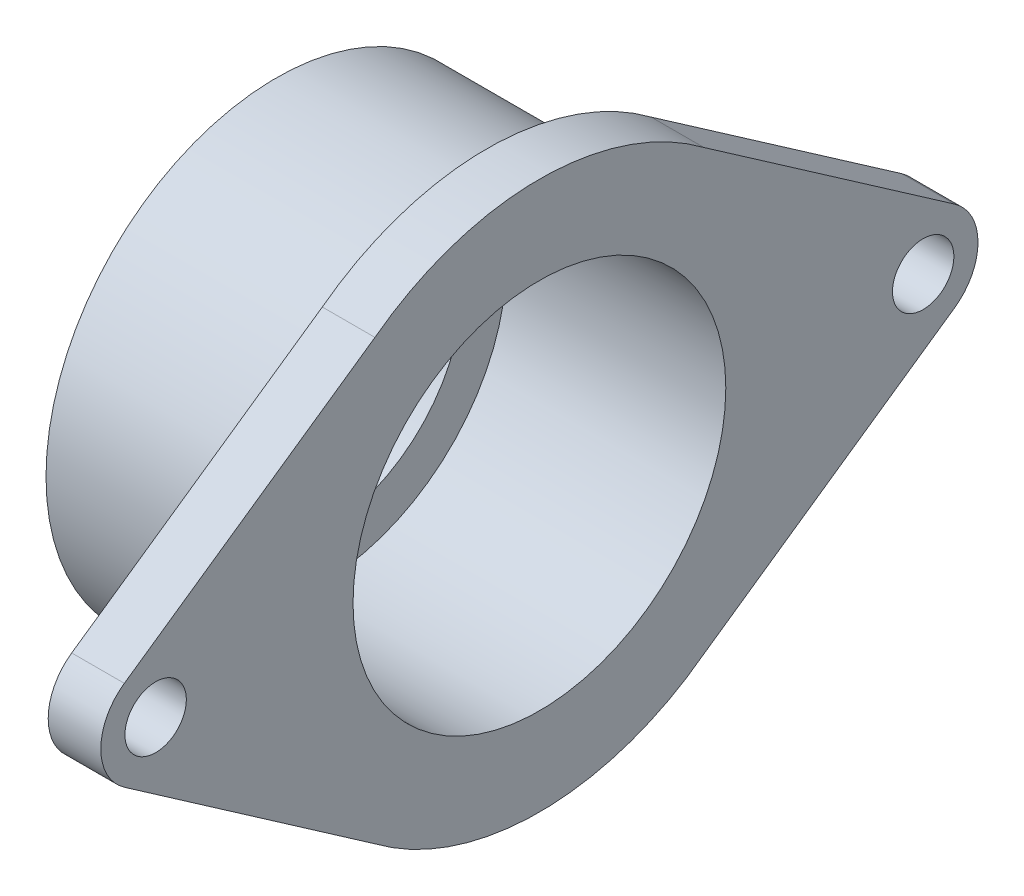
ISO-10303-21;
HEADER;
FILE_DESCRIPTION(('STEP AP214'),'2;1');
FILE_NAME('part.step','',(''),(''),'','','');
FILE_SCHEMA(('AUTOMOTIVE_DESIGN { 1 0 10303 214 1 1 1 1 }'));
ENDSEC;
DATA;
#1=APPLICATION_CONTEXT('core data for automotive mechanical design processes');
#2=APPLICATION_PROTOCOL_DEFINITION('international standard','automotive_design',2000,#1);
#3=PRODUCT_CONTEXT('',#1,'mechanical');
#4=PRODUCT('Part','Part','',(#3));
#5=PRODUCT_RELATED_PRODUCT_CATEGORY('part','',(#4));
#6=PRODUCT_DEFINITION_FORMATION('','',#4);
#7=PRODUCT_DEFINITION_CONTEXT('part definition',#1,'design');
#8=PRODUCT_DEFINITION('design','',#6,#7);
#9=PRODUCT_DEFINITION_SHAPE('','',#8);
#10=(LENGTH_UNIT() NAMED_UNIT(*) SI_UNIT(.MILLI.,.METRE.));
#11=(NAMED_UNIT(*) PLANE_ANGLE_UNIT() SI_UNIT($,.RADIAN.));
#12=(NAMED_UNIT(*) SI_UNIT($,.STERADIAN.) SOLID_ANGLE_UNIT());
#13=UNCERTAINTY_MEASURE_WITH_UNIT(LENGTH_MEASURE(1.E-05),#10,'distance_accuracy_value','');
#14=(GEOMETRIC_REPRESENTATION_CONTEXT(3) GLOBAL_UNCERTAINTY_ASSIGNED_CONTEXT((#13)) GLOBAL_UNIT_ASSIGNED_CONTEXT((#10,
#11,#12)) REPRESENTATION_CONTEXT('',''));
#15=CARTESIAN_POINT('',(0.,0.,0.));
#16=DIRECTION('',(0.,0.,1.));
#17=DIRECTION('',(1.,0.,0.));
#18=AXIS2_PLACEMENT_3D('',#15,#16,#17);
#19=CARTESIAN_POINT('',(-50.064308681672,-43.7218649517685,0.));
#20=DIRECTION('',(-1.,0.,0.));
#21=DIRECTION('',(0.,0.,1.));
#22=AXIS2_PLACEMENT_3D('',#19,#20,#21);
#23=CYLINDRICAL_SURFACE('',#22,52.5);
#24=CARTESIAN_POINT('',(-53.5048231511254,-43.7218649517685,0.));
#25=DIRECTION('',(-1.,0.,0.));
#26=DIRECTION('',(0.,0.,1.));
#27=AXIS2_PLACEMENT_3D('',#24,#25,#26);
#28=CIRCLE('',#27,52.5);
#29=CARTESIAN_POINT('',(-53.5048231511254,-43.7218649517685,52.5));
#30=VERTEX_POINT('',#29);
#31=EDGE_CURVE('E179',#30,#30,#28,.T.);
#32=ORIENTED_EDGE('',*,*,#31,.F.);
#33=EDGE_LOOP('',(#32));
#34=FACE_BOUND('',#33,.T.);
#35=CARTESIAN_POINT('',(-5.50482315112539,-43.7218649517685,0.));
#36=DIRECTION('',(1.,0.,0.));
#37=DIRECTION('',(0.,0.,-1.));
#38=AXIS2_PLACEMENT_3D('',#35,#36,#37);
#39=CIRCLE('',#38,52.5);
#40=CARTESIAN_POINT('',(-5.50482315112539,-43.7218649517685,-52.5));
#41=VERTEX_POINT('',#40);
#42=EDGE_CURVE('E11',#41,#41,#39,.T.);
#43=ORIENTED_EDGE('',*,*,#42,.F.);
#44=EDGE_LOOP('',(#43));
#45=FACE_BOUND('',#44,.T.);
#46=ADVANCED_FACE('F35',(#34,#45),#23,.T.);
#47=CARTESIAN_POINT('',(-50.064308681672,-43.7218649517685,0.));
#48=DIRECTION('',(-1.,0.,0.));
#49=DIRECTION('',(0.,0.,1.));
#50=AXIS2_PLACEMENT_3D('',#47,#48,#49);
#51=CYLINDRICAL_SURFACE('',#50,42.5);
#52=CARTESIAN_POINT('',(6.49517684887461,-43.7218649517685,0.));
#53=DIRECTION('',(-1.,0.,0.));
#54=DIRECTION('',(0.,0.,1.));
#55=AXIS2_PLACEMENT_3D('',#52,#53,#54);
#56=CIRCLE('',#55,42.5);
#57=CARTESIAN_POINT('',(6.49517684887461,-43.7218649517685,42.5));
#58=VERTEX_POINT('',#57);
#59=EDGE_CURVE('E45',#58,#58,#56,.T.);
#60=ORIENTED_EDGE('',*,*,#59,.F.);
#61=EDGE_LOOP('',(#60));
#62=FACE_BOUND('',#61,.T.);
#63=CARTESIAN_POINT('',(-43.5048231511254,-43.7218649517685,0.));
#64=DIRECTION('',(-1.,0.,0.));
#65=DIRECTION('',(0.,0.,1.));
#66=AXIS2_PLACEMENT_3D('',#63,#64,#65);
#67=CIRCLE('',#66,42.5);
#68=CARTESIAN_POINT('',(-43.5048231511254,-43.7218649517685,42.5));
#69=VERTEX_POINT('',#68);
#70=EDGE_CURVE('E161',#69,#69,#67,.T.);
#71=ORIENTED_EDGE('',*,*,#70,.T.);
#72=EDGE_LOOP('',(#71));
#73=FACE_BOUND('',#72,.T.);
#74=ADVANCED_FACE('F37',(#62,#73),#51,.F.);
#75=CARTESIAN_POINT('',(6.49517684887461,0.,0.));
#76=DIRECTION('',(-1.,0.,0.));
#77=DIRECTION('',(0.,0.,1.));
#78=AXIS2_PLACEMENT_3D('',#75,#76,#77);
#79=PLANE('',#78);
#80=CARTESIAN_POINT('',(6.49517684887461,-43.7218649517685,-87.5000000000338));
#81=DIRECTION('',(-1.,0.,0.));
#82=DIRECTION('',(0.,0.,1.));
#83=AXIS2_PLACEMENT_3D('',#80,#81,#82);
#84=CIRCLE('',#83,7.);
#85=CARTESIAN_POINT('',(6.49517684887461,-43.7218649517685,-80.5000000000338));
#86=VERTEX_POINT('',#85);
#87=EDGE_CURVE('E141',#86,#86,#84,.T.);
#88=ORIENTED_EDGE('',*,*,#87,.T.);
#89=EDGE_LOOP('',(#88));
#90=FACE_BOUND('',#89,.T.);
#91=CARTESIAN_POINT('',(6.49517684887461,-43.7218649517685,87.5000000000338));
#92=DIRECTION('',(-1.,0.,0.));
#93=DIRECTION('',(0.,0.,1.));
#94=AXIS2_PLACEMENT_3D('',#91,#92,#93);
#95=CIRCLE('',#94,7.);
#96=CARTESIAN_POINT('',(6.49517684887461,-43.7218649517685,94.5000000000338));
#97=VERTEX_POINT('',#96);
#98=EDGE_CURVE('E185',#97,#97,#95,.T.);
#99=ORIENTED_EDGE('',*,*,#98,.T.);
#100=EDGE_LOOP('',(#99));
#101=FACE_BOUND('',#100,.T.);
#102=ORIENTED_EDGE('',*,*,#59,.T.);
#103=EDGE_LOOP('',(#102));
#104=FACE_BOUND('',#103,.T.);
#105=CARTESIAN_POINT('',(6.49517684887461,-43.7218649517685,0.));
#106=DIRECTION('',(1.,0.,0.));
#107=DIRECTION('',(0.,0.,-1.));
#108=AXIS2_PLACEMENT_3D('',#105,#106,#107);
#109=CIRCLE('',#108,62.5);
#110=CARTESIAN_POINT('',(6.49517684887461,-93.7218649511816,37.5000000007826));
#111=VERTEX_POINT('',#110);
#112=CARTESIAN_POINT('',(6.49517684887461,-93.7218649511816,-37.5000000007826));
#113=VERTEX_POINT('',#112);
#114=EDGE_CURVE('E137',#111,#113,#109,.T.);
#115=ORIENTED_EDGE('',*,*,#114,.T.);
#116=DIRECTION('',(0.,0.570970545353112,-0.820970545354198));
#117=VECTOR('',#116,1.);
#118=CARTESIAN_POINT('',(6.49517684887461,-93.7218649511816,-37.5000000007826));
#119=LINE('',#118,#117);
#120=CARTESIAN_POINT('',(6.49517684887461,-53.983996768696,-94.6371318169478));
#121=VERTEX_POINT('',#120);
#122=EDGE_CURVE('E140',#113,#121,#119,.T.);
#123=ORIENTED_EDGE('',*,*,#122,.T.);
#124=CARTESIAN_POINT('',(6.49517684887461,-43.7218649517685,-87.5000000000338));
#125=DIRECTION('',(1.,0.,0.));
#126=DIRECTION('',(0.,0.,-1.));
#127=AXIS2_PLACEMENT_3D('',#124,#125,#126);
#128=CIRCLE('',#127,12.5);
#129=CARTESIAN_POINT('',(6.49517684887461,-33.459733134841,-94.6371318169478));
#130=VERTEX_POINT('',#129);
#131=EDGE_CURVE('E144',#121,#130,#128,.T.);
#132=ORIENTED_EDGE('',*,*,#131,.T.);
#133=DIRECTION('',(0.,0.570970545353112,0.820970545354198));
#134=VECTOR('',#133,1.);
#135=CARTESIAN_POINT('',(6.49517684887461,6.2781350476446,-37.5000000007826));
#136=LINE('',#135,#134);
#137=CARTESIAN_POINT('',(6.49517684887461,6.27813504764459,-37.5000000007826));
#138=VERTEX_POINT('',#137);
#139=EDGE_CURVE('E147',#130,#138,#136,.T.);
#140=ORIENTED_EDGE('',*,*,#139,.T.);
#141=CARTESIAN_POINT('',(6.49517684887461,-43.7218649517685,0.));
#142=DIRECTION('',(1.,0.,0.));
#143=DIRECTION('',(0.,0.,-1.));
#144=AXIS2_PLACEMENT_3D('',#141,#142,#143);
#145=CIRCLE('',#144,62.5);
#146=CARTESIAN_POINT('',(6.49517684887461,6.2781350476446,37.5000000007826));
#147=VERTEX_POINT('',#146);
#148=EDGE_CURVE('E150',#138,#147,#145,.T.);
#149=ORIENTED_EDGE('',*,*,#148,.T.);
#150=DIRECTION('',(0.,-0.570970545353112,0.820970545354198));
#151=VECTOR('',#150,1.);
#152=CARTESIAN_POINT('',(6.49517684887461,6.2781350476446,37.5000000007826));
#153=LINE('',#152,#151);
#154=CARTESIAN_POINT('',(6.49517684887461,-33.459733134841,94.6371318169477));
#155=VERTEX_POINT('',#154);
#156=EDGE_CURVE('E153',#147,#155,#153,.T.);
#157=ORIENTED_EDGE('',*,*,#156,.T.);
#158=CARTESIAN_POINT('',(6.49517684887461,-43.7218649517685,87.5000000000338));
#159=DIRECTION('',(1.,0.,0.));
#160=DIRECTION('',(0.,0.,-1.));
#161=AXIS2_PLACEMENT_3D('',#158,#159,#160);
#162=CIRCLE('',#161,12.5);
#163=CARTESIAN_POINT('',(6.49517684887461,-53.983996768696,94.6371318169477));
#164=VERTEX_POINT('',#163);
#165=EDGE_CURVE('E114',#155,#164,#162,.T.);
#166=ORIENTED_EDGE('',*,*,#165,.T.);
#167=DIRECTION('',(0.,-0.570970545353112,-0.820970545354199));
#168=VECTOR('',#167,1.);
#169=CARTESIAN_POINT('',(6.49517684887461,-93.7218649511816,37.5000000007826));
#170=LINE('',#169,#168);
#171=EDGE_CURVE('E156',#164,#111,#170,.T.);
#172=ORIENTED_EDGE('',*,*,#171,.T.);
#173=EDGE_LOOP('',(#115,#123,#132,#140,#149,#157,#166,#172));
#174=FACE_BOUND('',#173,.T.);
#175=ADVANCED_FACE('F214',(#90,#101,#104,#174),#79,.F.);
#176=CARTESIAN_POINT('',(-53.5048231511254,0.,0.));
#177=DIRECTION('',(1.,0.,0.));
#178=DIRECTION('',(0.,0.,-1.));
#179=AXIS2_PLACEMENT_3D('',#176,#177,#178);
#180=PLANE('',#179);
#181=CARTESIAN_POINT('',(-53.5048231511254,-43.7218649517685,0.));
#182=DIRECTION('',(-1.,0.,0.));
#183=DIRECTION('',(0.,0.,1.));
#184=AXIS2_PLACEMENT_3D('',#181,#182,#183);
#185=CIRCLE('',#184,32.5);
#186=CARTESIAN_POINT('',(-53.5048231511254,-43.7218649517685,32.5));
#187=VERTEX_POINT('',#186);
#188=EDGE_CURVE('E176',#187,#187,#185,.T.);
#189=ORIENTED_EDGE('',*,*,#188,.F.);
#190=EDGE_LOOP('',(#189));
#191=FACE_BOUND('',#190,.T.);
#192=ORIENTED_EDGE('',*,*,#31,.T.);
#193=EDGE_LOOP('',(#192));
#194=FACE_BOUND('',#193,.T.);
#195=ADVANCED_FACE('F236',(#191,#194),#180,.F.);
#196=CARTESIAN_POINT('',(-50.064308681672,-43.7218649517685,0.));
#197=DIRECTION('',(-1.,0.,0.));
#198=DIRECTION('',(0.,0.,1.));
#199=AXIS2_PLACEMENT_3D('',#196,#197,#198);
#200=CYLINDRICAL_SURFACE('',#199,32.5);
#201=CARTESIAN_POINT('',(-43.5048231511254,-43.7218649517685,0.));
#202=DIRECTION('',(-1.,0.,0.));
#203=DIRECTION('',(0.,0.,1.));
#204=AXIS2_PLACEMENT_3D('',#201,#202,#203);
#205=CIRCLE('',#204,32.5);
#206=CARTESIAN_POINT('',(-43.5048231511254,-43.7218649517685,32.5));
#207=VERTEX_POINT('',#206);
#208=EDGE_CURVE('E173',#207,#207,#205,.T.);
#209=ORIENTED_EDGE('',*,*,#208,.F.);
#210=EDGE_LOOP('',(#209));
#211=FACE_BOUND('',#210,.T.);
#212=ORIENTED_EDGE('',*,*,#188,.T.);
#213=EDGE_LOOP('',(#212));
#214=FACE_BOUND('',#213,.T.);
#215=ADVANCED_FACE('F243',(#211,#214),#200,.F.);
#216=CARTESIAN_POINT('',(-43.5048231511254,0.,0.));
#217=DIRECTION('',(-1.,0.,0.));
#218=DIRECTION('',(0.,0.,1.));
#219=AXIS2_PLACEMENT_3D('',#216,#217,#218);
#220=PLANE('',#219);
#221=ORIENTED_EDGE('',*,*,#70,.F.);
#222=EDGE_LOOP('',(#221));
#223=FACE_BOUND('',#222,.T.);
#224=ORIENTED_EDGE('',*,*,#208,.T.);
#225=EDGE_LOOP('',(#224));
#226=FACE_BOUND('',#225,.T.);
#227=ADVANCED_FACE('F223',(#223,#226),#220,.F.);
#228=CARTESIAN_POINT('',(-5.50482315112539,-43.7218649517685,0.));
#229=DIRECTION('',(1.,0.,0.));
#230=DIRECTION('',(0.,0.,-1.));
#231=AXIS2_PLACEMENT_3D('',#228,#229,#230);
#232=CYLINDRICAL_SURFACE('',#231,62.5);
#233=ORIENTED_EDGE('',*,*,#114,.F.);
#234=DIRECTION('',(1.,0.,0.));
#235=VECTOR('',#234,1.);
#236=CARTESIAN_POINT('',(-5.50482315112539,-93.7218649511816,37.5000000007826));
#237=LINE('',#236,#235);
#238=CARTESIAN_POINT('',(-5.50482315112539,-93.7218649511816,37.5000000007826));
#239=VERTEX_POINT('',#238);
#240=EDGE_CURVE('E54',#239,#111,#237,.T.);
#241=ORIENTED_EDGE('',*,*,#240,.F.);
#242=CARTESIAN_POINT('',(-5.50482315112539,-43.7218649517685,0.));
#243=DIRECTION('',(1.,0.,0.));
#244=DIRECTION('',(0.,0.,-1.));
#245=AXIS2_PLACEMENT_3D('',#242,#243,#244);
#246=CIRCLE('',#245,62.5);
#247=CARTESIAN_POINT('',(-5.50482315112539,-93.7218649511816,-37.5000000007826));
#248=VERTEX_POINT('',#247);
#249=EDGE_CURVE('E159',#239,#248,#246,.T.);
#250=ORIENTED_EDGE('',*,*,#249,.T.);
#251=DIRECTION('',(1.,0.,0.));
#252=VECTOR('',#251,1.);
#253=CARTESIAN_POINT('',(-5.50482315112539,-93.7218649511816,-37.5000000007826));
#254=LINE('',#253,#252);
#255=EDGE_CURVE('E95',#248,#113,#254,.T.);
#256=ORIENTED_EDGE('',*,*,#255,.T.);
#257=EDGE_LOOP('',(#233,#241,#250,#256));
#258=FACE_BOUND('',#257,.T.);
#259=ADVANCED_FACE('F212',(#258),#232,.T.);
#260=CARTESIAN_POINT('',(-5.50482315112539,-93.7218649511816,37.5000000007826));
#261=DIRECTION('',(0.,-0.820970545354199,0.570970545353112));
#262=DIRECTION('',(0.,-0.570970545353112,-0.820970545354199));
#263=AXIS2_PLACEMENT_3D('',#260,#261,#262);
#264=PLANE('',#263);
#265=ORIENTED_EDGE('',*,*,#171,.F.);
#266=DIRECTION('',(1.,0.,0.));
#267=VECTOR('',#266,1.);
#268=CARTESIAN_POINT('',(-5.50482315112539,-53.983996768696,94.6371318169477));
#269=LINE('',#268,#267);
#270=CARTESIAN_POINT('',(-5.50482315112539,-53.983996768696,94.6371318169477));
#271=VERTEX_POINT('',#270);
#272=EDGE_CURVE('E83',#271,#164,#269,.T.);
#273=ORIENTED_EDGE('',*,*,#272,.F.);
#274=DIRECTION('',(0.,-0.570970545353112,-0.820970545354199));
#275=VECTOR('',#274,1.);
#276=CARTESIAN_POINT('',(-5.50482315112539,-93.7218649511816,37.5000000007826));
#277=LINE('',#276,#275);
#278=EDGE_CURVE('E127',#271,#239,#277,.T.);
#279=ORIENTED_EDGE('',*,*,#278,.T.);
#280=ORIENTED_EDGE('',*,*,#240,.T.);
#281=EDGE_LOOP('',(#265,#273,#279,#280));
#282=FACE_BOUND('',#281,.T.);
#283=ADVANCED_FACE('F215',(#282),#264,.T.);
#284=CARTESIAN_POINT('',(-5.50482315112539,-43.7218649517685,87.5000000000338));
#285=DIRECTION('',(1.,0.,0.));
#286=DIRECTION('',(0.,0.,-1.));
#287=AXIS2_PLACEMENT_3D('',#284,#285,#286);
#288=CYLINDRICAL_SURFACE('',#287,12.5);
#289=ORIENTED_EDGE('',*,*,#165,.F.);
#290=DIRECTION('',(1.,0.,0.));
#291=VECTOR('',#290,1.);
#292=CARTESIAN_POINT('',(-5.50482315112539,-33.459733134841,94.6371318169477));
#293=LINE('',#292,#291);
#294=CARTESIAN_POINT('',(-5.50482315112539,-33.459733134841,94.6371318169477));
#295=VERTEX_POINT('',#294);
#296=EDGE_CURVE('E109',#295,#155,#293,.T.);
#297=ORIENTED_EDGE('',*,*,#296,.F.);
#298=CARTESIAN_POINT('',(-5.50482315112539,-43.7218649517685,87.5000000000338));
#299=DIRECTION('',(1.,0.,0.));
#300=DIRECTION('',(0.,0.,-1.));
#301=AXIS2_PLACEMENT_3D('',#298,#299,#300);
#302=CIRCLE('',#301,12.5);
#303=EDGE_CURVE('E112',#295,#271,#302,.T.);
#304=ORIENTED_EDGE('',*,*,#303,.T.);
#305=ORIENTED_EDGE('',*,*,#272,.T.);
#306=EDGE_LOOP('',(#289,#297,#304,#305));
#307=FACE_BOUND('',#306,.T.);
#308=ADVANCED_FACE('F111',(#307),#288,.T.);
#309=CARTESIAN_POINT('',(-5.50482315112539,6.2781350476446,37.5000000007826));
#310=DIRECTION('',(0.,0.820970545354198,0.570970545353112));
#311=DIRECTION('',(0.,-0.570970545353112,0.820970545354198));
#312=AXIS2_PLACEMENT_3D('',#309,#310,#311);
#313=PLANE('',#312);
#314=ORIENTED_EDGE('',*,*,#156,.F.);
#315=DIRECTION('',(1.,0.,0.));
#316=VECTOR('',#315,1.);
#317=CARTESIAN_POINT('',(-5.50482315112539,6.2781350476446,37.5000000007826));
#318=LINE('',#317,#316);
#319=CARTESIAN_POINT('',(-5.50482315112539,6.2781350476446,37.5000000007826));
#320=VERTEX_POINT('',#319);
#321=EDGE_CURVE('E119',#320,#147,#318,.T.);
#322=ORIENTED_EDGE('',*,*,#321,.F.);
#323=DIRECTION('',(0.,-0.570970545353112,0.820970545354198));
#324=VECTOR('',#323,1.);
#325=CARTESIAN_POINT('',(-5.50482315112539,6.2781350476446,37.5000000007826));
#326=LINE('',#325,#324);
#327=EDGE_CURVE('E125',#320,#295,#326,.T.);
#328=ORIENTED_EDGE('',*,*,#327,.T.);
#329=ORIENTED_EDGE('',*,*,#296,.T.);
#330=EDGE_LOOP('',(#314,#322,#328,#329));
#331=FACE_BOUND('',#330,.T.);
#332=ADVANCED_FACE('F129',(#331),#313,.T.);
#333=CARTESIAN_POINT('',(-5.50482315112539,-43.7218649517685,0.));
#334=DIRECTION('',(1.,0.,0.));
#335=DIRECTION('',(0.,0.,-1.));
#336=AXIS2_PLACEMENT_3D('',#333,#334,#335);
#337=CYLINDRICAL_SURFACE('',#336,62.5);
#338=ORIENTED_EDGE('',*,*,#148,.F.);
#339=DIRECTION('',(1.,0.,0.));
#340=VECTOR('',#339,1.);
#341=CARTESIAN_POINT('',(-5.50482315112539,6.27813504764459,-37.5000000007826));
#342=LINE('',#341,#340);
#343=CARTESIAN_POINT('',(-5.50482315112539,6.27813504764459,-37.5000000007826));
#344=VERTEX_POINT('',#343);
#345=EDGE_CURVE('E164',#344,#138,#342,.T.);
#346=ORIENTED_EDGE('',*,*,#345,.F.);
#347=CARTESIAN_POINT('',(-5.50482315112539,-43.7218649517685,0.));
#348=DIRECTION('',(1.,0.,0.));
#349=DIRECTION('',(0.,0.,-1.));
#350=AXIS2_PLACEMENT_3D('',#347,#348,#349);
#351=CIRCLE('',#350,62.5);
#352=EDGE_CURVE('E130',#344,#320,#351,.T.);
#353=ORIENTED_EDGE('',*,*,#352,.T.);
#354=ORIENTED_EDGE('',*,*,#321,.T.);
#355=EDGE_LOOP('',(#338,#346,#353,#354));
#356=FACE_BOUND('',#355,.T.);
#357=ADVANCED_FACE('F269',(#356),#337,.T.);
#358=CARTESIAN_POINT('',(-5.50482315112539,6.2781350476446,-37.5000000007826));
#359=DIRECTION('',(0.,0.820970545354198,-0.570970545353112));
#360=DIRECTION('',(0.,0.570970545353112,0.820970545354198));
#361=AXIS2_PLACEMENT_3D('',#358,#359,#360);
#362=PLANE('',#361);
#363=ORIENTED_EDGE('',*,*,#139,.F.);
#364=DIRECTION('',(1.,0.,0.));
#365=VECTOR('',#364,1.);
#366=CARTESIAN_POINT('',(-5.50482315112539,-33.459733134841,-94.6371318169478));
#367=LINE('',#366,#365);
#368=CARTESIAN_POINT('',(-5.50482315112539,-33.459733134841,-94.6371318169478));
#369=VERTEX_POINT('',#368);
#370=EDGE_CURVE('E166',#369,#130,#367,.T.);
#371=ORIENTED_EDGE('',*,*,#370,.F.);
#372=DIRECTION('',(0.,0.570970545353112,0.820970545354198));
#373=VECTOR('',#372,1.);
#374=CARTESIAN_POINT('',(-5.50482315112539,6.2781350476446,-37.5000000007826));
#375=LINE('',#374,#373);
#376=EDGE_CURVE('E132',#369,#344,#375,.T.);
#377=ORIENTED_EDGE('',*,*,#376,.T.);
#378=ORIENTED_EDGE('',*,*,#345,.T.);
#379=EDGE_LOOP('',(#363,#371,#377,#378));
#380=FACE_BOUND('',#379,.T.);
#381=ADVANCED_FACE('F205',(#380),#362,.T.);
#382=CARTESIAN_POINT('',(-5.50482315112539,-43.7218649517685,-87.5000000000338));
#383=DIRECTION('',(1.,0.,0.));
#384=DIRECTION('',(0.,0.,-1.));
#385=AXIS2_PLACEMENT_3D('',#382,#383,#384);
#386=CYLINDRICAL_SURFACE('',#385,12.5);
#387=ORIENTED_EDGE('',*,*,#131,.F.);
#388=DIRECTION('',(1.,0.,0.));
#389=VECTOR('',#388,1.);
#390=CARTESIAN_POINT('',(-5.50482315112539,-53.983996768696,-94.6371318169478));
#391=LINE('',#390,#389);
#392=CARTESIAN_POINT('',(-5.50482315112539,-53.983996768696,-94.6371318169478));
#393=VERTEX_POINT('',#392);
#394=EDGE_CURVE('E168',#393,#121,#391,.T.);
#395=ORIENTED_EDGE('',*,*,#394,.F.);
#396=CARTESIAN_POINT('',(-5.50482315112539,-43.7218649517685,-87.5000000000338));
#397=DIRECTION('',(1.,0.,0.));
#398=DIRECTION('',(0.,0.,-1.));
#399=AXIS2_PLACEMENT_3D('',#396,#397,#398);
#400=CIRCLE('',#399,12.5);
#401=EDGE_CURVE('E199',#393,#369,#400,.T.);
#402=ORIENTED_EDGE('',*,*,#401,.T.);
#403=ORIENTED_EDGE('',*,*,#370,.T.);
#404=EDGE_LOOP('',(#387,#395,#402,#403));
#405=FACE_BOUND('',#404,.T.);
#406=ADVANCED_FACE('F210',(#405),#386,.T.);
#407=CARTESIAN_POINT('',(-5.50482315112539,-93.7218649511816,-37.5000000007826));
#408=DIRECTION('',(0.,-0.820970545354198,-0.570970545353112));
#409=DIRECTION('',(0.,0.570970545353112,-0.820970545354198));
#410=AXIS2_PLACEMENT_3D('',#407,#408,#409);
#411=PLANE('',#410);
#412=ORIENTED_EDGE('',*,*,#122,.F.);
#413=ORIENTED_EDGE('',*,*,#255,.F.);
#414=DIRECTION('',(0.,0.570970545353112,-0.820970545354198));
#415=VECTOR('',#414,1.);
#416=CARTESIAN_POINT('',(-5.50482315112539,-93.7218649511816,-37.5000000007826));
#417=LINE('',#416,#415);
#418=EDGE_CURVE('E197',#248,#393,#417,.T.);
#419=ORIENTED_EDGE('',*,*,#418,.T.);
#420=ORIENTED_EDGE('',*,*,#394,.T.);
#421=EDGE_LOOP('',(#412,#413,#419,#420));
#422=FACE_BOUND('',#421,.T.);
#423=ADVANCED_FACE('F211',(#422),#411,.T.);
#424=CARTESIAN_POINT('',(-5.50482315112539,-43.7218649517685,0.));
#425=DIRECTION('',(1.,0.,0.));
#426=DIRECTION('',(0.,0.,-1.));
#427=AXIS2_PLACEMENT_3D('',#424,#425,#426);
#428=PLANE('',#427);
#429=CARTESIAN_POINT('',(-5.50482315112539,-43.7218649517685,-87.5000000000338));
#430=DIRECTION('',(1.,0.,0.));
#431=DIRECTION('',(0.,0.,-1.));
#432=AXIS2_PLACEMENT_3D('',#429,#430,#431);
#433=CIRCLE('',#432,7.);
#434=CARTESIAN_POINT('',(-5.50482315112539,-43.7218649517685,-94.5000000000338));
#435=VERTEX_POINT('',#434);
#436=EDGE_CURVE('E39',#435,#435,#433,.T.);
#437=ORIENTED_EDGE('',*,*,#436,.T.);
#438=EDGE_LOOP('',(#437));
#439=FACE_BOUND('',#438,.T.);
#440=CARTESIAN_POINT('',(-5.50482315112539,-43.7218649517685,87.5000000000338));
#441=DIRECTION('',(1.,0.,0.));
#442=DIRECTION('',(0.,0.,-1.));
#443=AXIS2_PLACEMENT_3D('',#440,#441,#442);
#444=CIRCLE('',#443,7.);
#445=CARTESIAN_POINT('',(-5.50482315112539,-43.7218649517685,80.5000000000338));
#446=VERTEX_POINT('',#445);
#447=EDGE_CURVE('E183',#446,#446,#444,.T.);
#448=ORIENTED_EDGE('',*,*,#447,.T.);
#449=EDGE_LOOP('',(#448));
#450=FACE_BOUND('',#449,.T.);
#451=ORIENTED_EDGE('',*,*,#42,.T.);
#452=EDGE_LOOP('',(#451));
#453=FACE_BOUND('',#452,.T.);
#454=ORIENTED_EDGE('',*,*,#249,.F.);
#455=ORIENTED_EDGE('',*,*,#278,.F.);
#456=ORIENTED_EDGE('',*,*,#303,.F.);
#457=ORIENTED_EDGE('',*,*,#327,.F.);
#458=ORIENTED_EDGE('',*,*,#352,.F.);
#459=ORIENTED_EDGE('',*,*,#376,.F.);
#460=ORIENTED_EDGE('',*,*,#401,.F.);
#461=ORIENTED_EDGE('',*,*,#418,.F.);
#462=EDGE_LOOP('',(#454,#455,#456,#457,#458,#459,#460,#461));
#463=FACE_BOUND('',#462,.T.);
#464=ADVANCED_FACE('F123',(#439,#450,#453,#463),#428,.F.);
#465=CARTESIAN_POINT('',(-53.5048231511254,-43.7218649517685,87.5000000000338));
#466=DIRECTION('',(1.,0.,0.));
#467=DIRECTION('',(0.,0.,-1.));
#468=AXIS2_PLACEMENT_3D('',#465,#466,#467);
#469=CYLINDRICAL_SURFACE('',#468,7.);
#470=ORIENTED_EDGE('',*,*,#447,.F.);
#471=EDGE_LOOP('',(#470));
#472=FACE_BOUND('',#471,.T.);
#473=ORIENTED_EDGE('',*,*,#98,.F.);
#474=EDGE_LOOP('',(#473));
#475=FACE_BOUND('',#474,.T.);
#476=ADVANCED_FACE('F300',(#472,#475),#469,.F.);
#477=CARTESIAN_POINT('',(-53.5048231511254,-43.7218649517685,-87.5000000000338));
#478=DIRECTION('',(1.,0.,0.));
#479=DIRECTION('',(0.,0.,-1.));
#480=AXIS2_PLACEMENT_3D('',#477,#478,#479);
#481=CYLINDRICAL_SURFACE('',#480,7.);
#482=ORIENTED_EDGE('',*,*,#436,.F.);
#483=EDGE_LOOP('',(#482));
#484=FACE_BOUND('',#483,.T.);
#485=ORIENTED_EDGE('',*,*,#87,.F.);
#486=EDGE_LOOP('',(#485));
#487=FACE_BOUND('',#486,.T.);
#488=ADVANCED_FACE('F307',(#484,#487),#481,.F.);
#489=CLOSED_SHELL('',(#46,#74,#175,#195,#215,#227,#259,#283,#308,#332,#357,#381,#406,#423,#464,
#476,#488));
#490=MANIFOLD_SOLID_BREP('B2',#489);
#491=ADVANCED_BREP_SHAPE_REPRESENTATION('',(#18,#490),#14);
#492=SHAPE_DEFINITION_REPRESENTATION(#9,#491);
ENDSEC;
END-ISO-10303-21;
